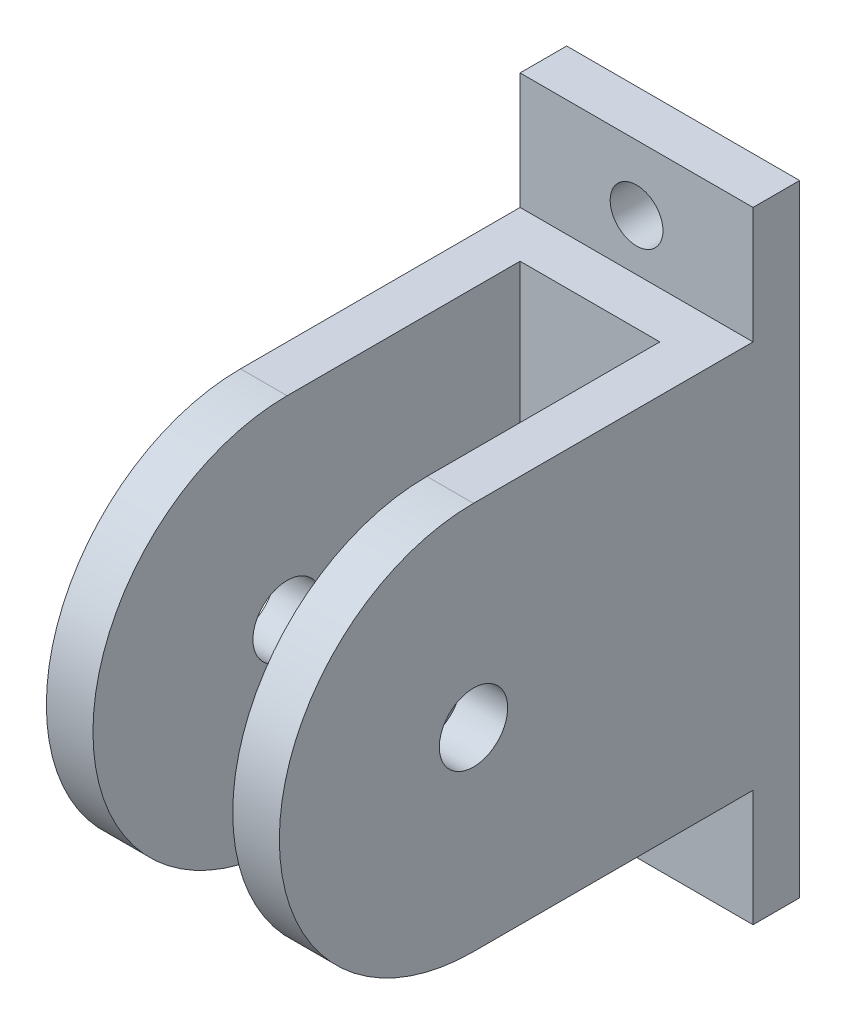
ISO-10303-21;
HEADER;
FILE_DESCRIPTION(('STEP AP214'),'2;1');
FILE_NAME('part.step','',(''),(''),'','','');
FILE_SCHEMA(('AUTOMOTIVE_DESIGN { 1 0 10303 214 1 1 1 1 }'));
ENDSEC;
DATA;
#1=APPLICATION_CONTEXT('core data for automotive mechanical design processes');
#2=APPLICATION_PROTOCOL_DEFINITION('international standard','automotive_design',2000,#1);
#3=PRODUCT_CONTEXT('',#1,'mechanical');
#4=PRODUCT('Part','Part','',(#3));
#5=PRODUCT_RELATED_PRODUCT_CATEGORY('part','',(#4));
#6=PRODUCT_DEFINITION_FORMATION('','',#4);
#7=PRODUCT_DEFINITION_CONTEXT('part definition',#1,'design');
#8=PRODUCT_DEFINITION('design','',#6,#7);
#9=PRODUCT_DEFINITION_SHAPE('','',#8);
#10=(LENGTH_UNIT() NAMED_UNIT(*) SI_UNIT(.MILLI.,.METRE.));
#11=(NAMED_UNIT(*) PLANE_ANGLE_UNIT() SI_UNIT($,.RADIAN.));
#12=(NAMED_UNIT(*) SI_UNIT($,.STERADIAN.) SOLID_ANGLE_UNIT());
#13=UNCERTAINTY_MEASURE_WITH_UNIT(LENGTH_MEASURE(1.E-05),#10,'distance_accuracy_value','');
#14=(GEOMETRIC_REPRESENTATION_CONTEXT(3) GLOBAL_UNCERTAINTY_ASSIGNED_CONTEXT((#13)) GLOBAL_UNIT_ASSIGNED_CONTEXT((#10,
#11,#12)) REPRESENTATION_CONTEXT('',''));
#15=CARTESIAN_POINT('',(0.,0.,0.));
#16=DIRECTION('',(0.,0.,1.));
#17=DIRECTION('',(1.,0.,0.));
#18=AXIS2_PLACEMENT_3D('',#15,#16,#17);
#19=CARTESIAN_POINT('',(0.,0.,6.));
#20=DIRECTION('',(0.,0.,1.));
#21=DIRECTION('',(1.,0.,0.));
#22=AXIS2_PLACEMENT_3D('',#19,#20,#21);
#23=PLANE('',#22);
#24=DIRECTION('',(1.,0.,0.));
#25=VECTOR('',#24,1.);
#26=CARTESIAN_POINT('',(-10.,-12.5,6.));
#27=LINE('',#26,#25);
#28=CARTESIAN_POINT('',(-7.,-12.5,6.));
#29=VERTEX_POINT('',#28);
#30=CARTESIAN_POINT('',(2.,-12.5,6.));
#31=VERTEX_POINT('',#30);
#32=EDGE_CURVE('E50',#29,#31,#27,.T.);
#33=ORIENTED_EDGE('',*,*,#32,.T.);
#34=DIRECTION('',(0.,1.,0.));
#35=VECTOR('',#34,1.);
#36=CARTESIAN_POINT('',(2.,-12.5,6.));
#37=LINE('',#36,#35);
#38=CARTESIAN_POINT('',(2.,12.5,6.));
#39=VERTEX_POINT('',#38);
#40=EDGE_CURVE('E137',#31,#39,#37,.T.);
#41=ORIENTED_EDGE('',*,*,#40,.T.);
#42=DIRECTION('',(-1.,0.,0.));
#43=VECTOR('',#42,1.);
#44=CARTESIAN_POINT('',(-10.,12.5,6.));
#45=LINE('',#44,#43);
#46=CARTESIAN_POINT('',(-7.,12.5,6.));
#47=VERTEX_POINT('',#46);
#48=EDGE_CURVE('E127',#39,#47,#45,.T.);
#49=ORIENTED_EDGE('',*,*,#48,.T.);
#50=DIRECTION('',(0.,-1.,0.));
#51=VECTOR('',#50,1.);
#52=CARTESIAN_POINT('',(-7.,12.5,6.));
#53=LINE('',#52,#51);
#54=EDGE_CURVE('E165',#47,#29,#53,.T.);
#55=ORIENTED_EDGE('',*,*,#54,.T.);
#56=EDGE_LOOP('',(#33,#41,#49,#55));
#57=FACE_BOUND('',#56,.T.);
#58=ADVANCED_FACE('F33',(#57),#23,.T.);
#59=CARTESIAN_POINT('',(0.,0.,3.));
#60=DIRECTION('',(0.,0.,1.));
#61=DIRECTION('',(1.,0.,0.));
#62=AXIS2_PLACEMENT_3D('',#59,#60,#61);
#63=PLANE('',#62);
#64=CARTESIAN_POINT('',(-2.5,15.8,3.));
#65=DIRECTION('',(0.,0.,1.));
#66=DIRECTION('',(1.,0.,0.));
#67=AXIS2_PLACEMENT_3D('',#64,#65,#66);
#68=CIRCLE('',#67,1.7);
#69=CARTESIAN_POINT('',(-0.800000000000002,15.8,3.));
#70=VERTEX_POINT('',#69);
#71=EDGE_CURVE('E286',#70,#70,#68,.T.);
#72=ORIENTED_EDGE('',*,*,#71,.F.);
#73=EDGE_LOOP('',(#72));
#74=FACE_BOUND('',#73,.T.);
#75=DIRECTION('',(-1.,0.,0.));
#76=VECTOR('',#75,1.);
#77=CARTESIAN_POINT('',(-10.,12.5,3.));
#78=LINE('',#77,#76);
#79=CARTESIAN_POINT('',(5.,12.5,3.));
#80=VERTEX_POINT('',#79);
#81=CARTESIAN_POINT('',(-10.,12.5,3.));
#82=VERTEX_POINT('',#81);
#83=EDGE_CURVE('E190',#80,#82,#78,.T.);
#84=ORIENTED_EDGE('',*,*,#83,.F.);
#85=DIRECTION('',(0.,1.,0.));
#86=VECTOR('',#85,1.);
#87=CARTESIAN_POINT('',(5.,20.,3.));
#88=LINE('',#87,#86);
#89=CARTESIAN_POINT('',(5.,20.,3.));
#90=VERTEX_POINT('',#89);
#91=EDGE_CURVE('E192',#80,#90,#88,.T.);
#92=ORIENTED_EDGE('',*,*,#91,.T.);
#93=DIRECTION('',(-1.,0.,0.));
#94=VECTOR('',#93,1.);
#95=CARTESIAN_POINT('',(-10.,20.,3.));
#96=LINE('',#95,#94);
#97=CARTESIAN_POINT('',(-10.,20.,3.));
#98=VERTEX_POINT('',#97);
#99=EDGE_CURVE('E225',#90,#98,#96,.T.);
#100=ORIENTED_EDGE('',*,*,#99,.T.);
#101=DIRECTION('',(0.,-1.,0.));
#102=VECTOR('',#101,1.);
#103=CARTESIAN_POINT('',(-10.,20.,3.));
#104=LINE('',#103,#102);
#105=EDGE_CURVE('E226',#98,#82,#104,.T.);
#106=ORIENTED_EDGE('',*,*,#105,.T.);
#107=EDGE_LOOP('',(#84,#92,#100,#106));
#108=FACE_BOUND('',#107,.T.);
#109=ADVANCED_FACE('F321',(#74,#108),#63,.T.);
#110=CARTESIAN_POINT('',(-10.,20.,3.));
#111=DIRECTION('',(1.,0.,0.));
#112=DIRECTION('',(0.,1.,0.));
#113=AXIS2_PLACEMENT_3D('',#110,#111,#112);
#114=PLANE('',#113);
#115=CARTESIAN_POINT('',(-10.,0.,21.));
#116=DIRECTION('',(1.,0.,0.));
#117=DIRECTION('',(0.,1.,0.));
#118=AXIS2_PLACEMENT_3D('',#115,#116,#117);
#119=CIRCLE('',#118,2.2);
#120=CARTESIAN_POINT('',(-10.,2.2,21.));
#121=VERTEX_POINT('',#120);
#122=EDGE_CURVE('E154',#121,#121,#119,.T.);
#123=ORIENTED_EDGE('',*,*,#122,.T.);
#124=EDGE_LOOP('',(#123));
#125=FACE_BOUND('',#124,.T.);
#126=DIRECTION('',(0.,-1.,0.));
#127=VECTOR('',#126,1.);
#128=CARTESIAN_POINT('',(-10.,20.,0.));
#129=LINE('',#128,#127);
#130=CARTESIAN_POINT('',(-10.,20.,0.));
#131=VERTEX_POINT('',#130);
#132=CARTESIAN_POINT('',(-9.99999999999999,-20.,0.));
#133=VERTEX_POINT('',#132);
#134=EDGE_CURVE('E204',#131,#133,#129,.T.);
#135=ORIENTED_EDGE('',*,*,#134,.T.);
#136=DIRECTION('',(0.,0.,-1.));
#137=VECTOR('',#136,1.);
#138=CARTESIAN_POINT('',(-9.99999999999999,-20.,3.));
#139=LINE('',#138,#137);
#140=CARTESIAN_POINT('',(-9.99999999999999,-20.,3.));
#141=VERTEX_POINT('',#140);
#142=EDGE_CURVE('E11',#141,#133,#139,.T.);
#143=ORIENTED_EDGE('',*,*,#142,.F.);
#144=CARTESIAN_POINT('',(-10.,-12.5,3.));
#145=VERTEX_POINT('',#144);
#146=EDGE_CURVE('E231',#145,#141,#104,.T.);
#147=ORIENTED_EDGE('',*,*,#146,.F.);
#148=DIRECTION('',(0.,0.,-1.));
#149=VECTOR('',#148,1.);
#150=CARTESIAN_POINT('',(-10.,-12.5,6.));
#151=LINE('',#150,#149);
#152=CARTESIAN_POINT('',(-10.,-12.5,21.));
#153=VERTEX_POINT('',#152);
#154=EDGE_CURVE('E198',#153,#145,#151,.T.);
#155=ORIENTED_EDGE('',*,*,#154,.F.);
#156=CARTESIAN_POINT('',(-10.,0.,21.));
#157=DIRECTION('',(-1.,0.,0.));
#158=DIRECTION('',(0.,1.,0.));
#159=AXIS2_PLACEMENT_3D('',#156,#157,#158);
#160=CIRCLE('',#159,12.5);
#161=CARTESIAN_POINT('',(-10.,12.5,21.));
#162=VERTEX_POINT('',#161);
#163=EDGE_CURVE('E158',#153,#162,#160,.T.);
#164=ORIENTED_EDGE('',*,*,#163,.T.);
#165=DIRECTION('',(0.,0.,-1.));
#166=VECTOR('',#165,1.);
#167=CARTESIAN_POINT('',(-10.,12.5,6.));
#168=LINE('',#167,#166);
#169=EDGE_CURVE('E136',#162,#82,#168,.T.);
#170=ORIENTED_EDGE('',*,*,#169,.T.);
#171=ORIENTED_EDGE('',*,*,#105,.F.);
#172=DIRECTION('',(0.,0.,-1.));
#173=VECTOR('',#172,1.);
#174=CARTESIAN_POINT('',(-10.,20.,3.));
#175=LINE('',#174,#173);
#176=EDGE_CURVE('E244',#98,#131,#175,.T.);
#177=ORIENTED_EDGE('',*,*,#176,.T.);
#178=EDGE_LOOP('',(#135,#143,#147,#155,#164,#170,#171,#177));
#179=FACE_BOUND('',#178,.T.);
#180=ADVANCED_FACE('F35',(#125,#179),#114,.F.);
#181=CARTESIAN_POINT('',(-9.99999999999999,-20.,3.));
#182=DIRECTION('',(0.,1.,0.));
#183=DIRECTION('',(0.,0.,1.));
#184=AXIS2_PLACEMENT_3D('',#181,#182,#183);
#185=PLANE('',#184);
#186=DIRECTION('',(1.,0.,0.));
#187=VECTOR('',#186,1.);
#188=CARTESIAN_POINT('',(-9.99999999999999,-20.,0.));
#189=LINE('',#188,#187);
#190=CARTESIAN_POINT('',(5.,-20.,0.));
#191=VERTEX_POINT('',#190);
#192=EDGE_CURVE('E250',#133,#191,#189,.T.);
#193=ORIENTED_EDGE('',*,*,#192,.T.);
#194=DIRECTION('',(0.,0.,-1.));
#195=VECTOR('',#194,1.);
#196=CARTESIAN_POINT('',(5.,-20.,3.));
#197=LINE('',#196,#195);
#198=CARTESIAN_POINT('',(5.,-20.,3.));
#199=VERTEX_POINT('',#198);
#200=EDGE_CURVE('E42',#199,#191,#197,.T.);
#201=ORIENTED_EDGE('',*,*,#200,.F.);
#202=DIRECTION('',(1.,0.,0.));
#203=VECTOR('',#202,1.);
#204=CARTESIAN_POINT('',(-9.99999999999999,-20.,3.));
#205=LINE('',#204,#203);
#206=EDGE_CURVE('E224',#141,#199,#205,.T.);
#207=ORIENTED_EDGE('',*,*,#206,.F.);
#208=ORIENTED_EDGE('',*,*,#142,.T.);
#209=EDGE_LOOP('',(#193,#201,#207,#208));
#210=FACE_BOUND('',#209,.T.);
#211=ADVANCED_FACE('F263',(#210),#185,.F.);
#212=CARTESIAN_POINT('',(5.,20.,3.));
#213=DIRECTION('',(-1.,0.,0.));
#214=DIRECTION('',(0.,-1.,0.));
#215=AXIS2_PLACEMENT_3D('',#212,#213,#214);
#216=PLANE('',#215);
#217=CARTESIAN_POINT('',(5.,0.,21.));
#218=DIRECTION('',(-1.,0.,0.));
#219=DIRECTION('',(0.,-1.,0.));
#220=AXIS2_PLACEMENT_3D('',#217,#218,#219);
#221=CIRCLE('',#220,2.2);
#222=CARTESIAN_POINT('',(5.,-2.2,21.));
#223=VERTEX_POINT('',#222);
#224=EDGE_CURVE('E280',#223,#223,#221,.T.);
#225=ORIENTED_EDGE('',*,*,#224,.T.);
#226=EDGE_LOOP('',(#225));
#227=FACE_BOUND('',#226,.T.);
#228=DIRECTION('',(0.,1.,0.));
#229=VECTOR('',#228,1.);
#230=CARTESIAN_POINT('',(5.,20.,0.));
#231=LINE('',#230,#229);
#232=CARTESIAN_POINT('',(5.,20.,0.));
#233=VERTEX_POINT('',#232);
#234=EDGE_CURVE('E248',#191,#233,#231,.T.);
#235=ORIENTED_EDGE('',*,*,#234,.T.);
#236=DIRECTION('',(0.,0.,-1.));
#237=VECTOR('',#236,1.);
#238=CARTESIAN_POINT('',(5.,20.,3.));
#239=LINE('',#238,#237);
#240=EDGE_CURVE('E220',#90,#233,#239,.T.);
#241=ORIENTED_EDGE('',*,*,#240,.F.);
#242=ORIENTED_EDGE('',*,*,#91,.F.);
#243=DIRECTION('',(0.,0.,-1.));
#244=VECTOR('',#243,1.);
#245=CARTESIAN_POINT('',(5.,12.5,6.));
#246=LINE('',#245,#244);
#247=CARTESIAN_POINT('',(5.,12.5,21.));
#248=VERTEX_POINT('',#247);
#249=EDGE_CURVE('E199',#248,#80,#246,.T.);
#250=ORIENTED_EDGE('',*,*,#249,.F.);
#251=CARTESIAN_POINT('',(5.,0.,21.));
#252=DIRECTION('',(1.,0.,0.));
#253=DIRECTION('',(0.,0.,-1.));
#254=AXIS2_PLACEMENT_3D('',#251,#252,#253);
#255=CIRCLE('',#254,12.5);
#256=CARTESIAN_POINT('',(5.,-12.5,21.));
#257=VERTEX_POINT('',#256);
#258=EDGE_CURVE('E151',#248,#257,#255,.T.);
#259=ORIENTED_EDGE('',*,*,#258,.T.);
#260=DIRECTION('',(0.,0.,-1.));
#261=VECTOR('',#260,1.);
#262=CARTESIAN_POINT('',(5.,-12.5,6.));
#263=LINE('',#262,#261);
#264=CARTESIAN_POINT('',(5.,-12.5,3.));
#265=VERTEX_POINT('',#264);
#266=EDGE_CURVE('E195',#257,#265,#263,.T.);
#267=ORIENTED_EDGE('',*,*,#266,.T.);
#268=EDGE_CURVE('E223',#199,#265,#88,.T.);
#269=ORIENTED_EDGE('',*,*,#268,.F.);
#270=ORIENTED_EDGE('',*,*,#200,.T.);
#271=EDGE_LOOP('',(#235,#241,#242,#250,#259,#267,#269,#270));
#272=FACE_BOUND('',#271,.T.);
#273=ADVANCED_FACE('F217',(#227,#272),#216,.F.);
#274=CARTESIAN_POINT('',(-10.,20.,3.));
#275=DIRECTION('',(0.,-1.,0.));
#276=DIRECTION('',(0.,0.,-1.));
#277=AXIS2_PLACEMENT_3D('',#274,#275,#276);
#278=PLANE('',#277);
#279=DIRECTION('',(-1.,0.,0.));
#280=VECTOR('',#279,1.);
#281=CARTESIAN_POINT('',(-10.,20.,0.));
#282=LINE('',#281,#280);
#283=EDGE_CURVE('E239',#233,#131,#282,.T.);
#284=ORIENTED_EDGE('',*,*,#283,.T.);
#285=ORIENTED_EDGE('',*,*,#176,.F.);
#286=ORIENTED_EDGE('',*,*,#99,.F.);
#287=ORIENTED_EDGE('',*,*,#240,.T.);
#288=EDGE_LOOP('',(#284,#285,#286,#287));
#289=FACE_BOUND('',#288,.T.);
#290=ADVANCED_FACE('F336',(#289),#278,.F.);
#291=CARTESIAN_POINT('',(-2.5,-15.8,3.));
#292=DIRECTION('',(0.,0.,1.));
#293=DIRECTION('',(1.,0.,0.));
#294=AXIS2_PLACEMENT_3D('',#291,#292,#293);
#295=CIRCLE('',#294,1.7);
#296=CARTESIAN_POINT('',(-0.800000000000002,-15.8,3.));
#297=VERTEX_POINT('',#296);
#298=EDGE_CURVE('E292',#297,#297,#295,.T.);
#299=ORIENTED_EDGE('',*,*,#298,.F.);
#300=EDGE_LOOP('',(#299));
#301=FACE_BOUND('',#300,.T.);
#302=DIRECTION('',(1.,0.,0.));
#303=VECTOR('',#302,1.);
#304=CARTESIAN_POINT('',(-10.,-12.5,3.));
#305=LINE('',#304,#303);
#306=EDGE_CURVE('E186',#145,#265,#305,.T.);
#307=ORIENTED_EDGE('',*,*,#306,.F.);
#308=ORIENTED_EDGE('',*,*,#146,.T.);
#309=ORIENTED_EDGE('',*,*,#206,.T.);
#310=ORIENTED_EDGE('',*,*,#268,.T.);
#311=EDGE_LOOP('',(#307,#308,#309,#310));
#312=FACE_BOUND('',#311,.T.);
#313=ADVANCED_FACE('F265',(#301,#312),#63,.T.);
#314=CARTESIAN_POINT('',(0.,0.,0.));
#315=DIRECTION('',(0.,0.,1.));
#316=DIRECTION('',(1.,0.,0.));
#317=AXIS2_PLACEMENT_3D('',#314,#315,#316);
#318=PLANE('',#317);
#319=CARTESIAN_POINT('',(-2.5,-15.8,0.));
#320=DIRECTION('',(0.,0.,-1.));
#321=DIRECTION('',(1.,0.,0.));
#322=AXIS2_PLACEMENT_3D('',#319,#320,#321);
#323=CIRCLE('',#322,1.7);
#324=CARTESIAN_POINT('',(-0.800000000000002,-15.8,0.));
#325=VERTEX_POINT('',#324);
#326=EDGE_CURVE('E295',#325,#325,#323,.T.);
#327=ORIENTED_EDGE('',*,*,#326,.F.);
#328=EDGE_LOOP('',(#327));
#329=FACE_BOUND('',#328,.T.);
#330=CARTESIAN_POINT('',(-2.5,15.8,0.));
#331=DIRECTION('',(0.,0.,-1.));
#332=DIRECTION('',(-1.,0.,0.));
#333=AXIS2_PLACEMENT_3D('',#330,#331,#332);
#334=CIRCLE('',#333,1.7);
#335=CARTESIAN_POINT('',(-4.2,15.8,0.));
#336=VERTEX_POINT('',#335);
#337=EDGE_CURVE('E289',#336,#336,#334,.T.);
#338=ORIENTED_EDGE('',*,*,#337,.F.);
#339=EDGE_LOOP('',(#338));
#340=FACE_BOUND('',#339,.T.);
#341=ORIENTED_EDGE('',*,*,#134,.F.);
#342=ORIENTED_EDGE('',*,*,#283,.F.);
#343=ORIENTED_EDGE('',*,*,#234,.F.);
#344=ORIENTED_EDGE('',*,*,#192,.F.);
#345=EDGE_LOOP('',(#341,#342,#343,#344));
#346=FACE_BOUND('',#345,.T.);
#347=ADVANCED_FACE('F260',(#329,#340,#346),#318,.F.);
#348=CARTESIAN_POINT('',(-10.,-12.5,6.));
#349=DIRECTION('',(0.,1.,0.));
#350=DIRECTION('',(0.,0.,1.));
#351=AXIS2_PLACEMENT_3D('',#348,#349,#350);
#352=PLANE('',#351);
#353=ORIENTED_EDGE('',*,*,#306,.T.);
#354=ORIENTED_EDGE('',*,*,#266,.F.);
#355=DIRECTION('',(1.,0.,0.));
#356=VECTOR('',#355,1.);
#357=CARTESIAN_POINT('',(2.,-12.5,21.));
#358=LINE('',#357,#356);
#359=CARTESIAN_POINT('',(2.,-12.5,21.));
#360=VERTEX_POINT('',#359);
#361=EDGE_CURVE('E155',#360,#257,#358,.T.);
#362=ORIENTED_EDGE('',*,*,#361,.F.);
#363=DIRECTION('',(0.,0.,-1.));
#364=VECTOR('',#363,1.);
#365=CARTESIAN_POINT('',(2.,-12.5,6.));
#366=LINE('',#365,#364);
#367=EDGE_CURVE('E141',#360,#31,#366,.T.);
#368=ORIENTED_EDGE('',*,*,#367,.T.);
#369=ORIENTED_EDGE('',*,*,#32,.F.);
#370=DIRECTION('',(0.,0.,1.));
#371=VECTOR('',#370,1.);
#372=CARTESIAN_POINT('',(-7.,-12.5,6.));
#373=LINE('',#372,#371);
#374=CARTESIAN_POINT('',(-7.,-12.5,21.));
#375=VERTEX_POINT('',#374);
#376=EDGE_CURVE('E58',#29,#375,#373,.T.);
#377=ORIENTED_EDGE('',*,*,#376,.T.);
#378=DIRECTION('',(-1.,0.,0.));
#379=VECTOR('',#378,1.);
#380=CARTESIAN_POINT('',(-7.,-12.5,21.));
#381=LINE('',#380,#379);
#382=EDGE_CURVE('E174',#375,#153,#381,.T.);
#383=ORIENTED_EDGE('',*,*,#382,.T.);
#384=ORIENTED_EDGE('',*,*,#154,.T.);
#385=EDGE_LOOP('',(#353,#354,#362,#368,#369,#377,#383,#384));
#386=FACE_BOUND('',#385,.T.);
#387=ADVANCED_FACE('F267',(#386),#352,.F.);
#388=CARTESIAN_POINT('',(-10.,12.5,6.));
#389=DIRECTION('',(0.,-1.,0.));
#390=DIRECTION('',(0.,0.,-1.));
#391=AXIS2_PLACEMENT_3D('',#388,#389,#390);
#392=PLANE('',#391);
#393=ORIENTED_EDGE('',*,*,#83,.T.);
#394=ORIENTED_EDGE('',*,*,#169,.F.);
#395=DIRECTION('',(-1.,0.,0.));
#396=VECTOR('',#395,1.);
#397=CARTESIAN_POINT('',(-7.,12.5,21.));
#398=LINE('',#397,#396);
#399=CARTESIAN_POINT('',(-7.,12.5,21.));
#400=VERTEX_POINT('',#399);
#401=EDGE_CURVE('E191',#400,#162,#398,.T.);
#402=ORIENTED_EDGE('',*,*,#401,.F.);
#403=DIRECTION('',(0.,0.,-1.));
#404=VECTOR('',#403,1.);
#405=CARTESIAN_POINT('',(-7.,12.5,6.));
#406=LINE('',#405,#404);
#407=EDGE_CURVE('E135',#400,#47,#406,.T.);
#408=ORIENTED_EDGE('',*,*,#407,.T.);
#409=ORIENTED_EDGE('',*,*,#48,.F.);
#410=DIRECTION('',(0.,0.,1.));
#411=VECTOR('',#410,1.);
#412=CARTESIAN_POINT('',(2.,12.5,6.));
#413=LINE('',#412,#411);
#414=CARTESIAN_POINT('',(2.,12.5,21.));
#415=VERTEX_POINT('',#414);
#416=EDGE_CURVE('E132',#39,#415,#413,.T.);
#417=ORIENTED_EDGE('',*,*,#416,.T.);
#418=DIRECTION('',(1.,0.,0.));
#419=VECTOR('',#418,1.);
#420=CARTESIAN_POINT('',(2.,12.5,21.));
#421=LINE('',#420,#419);
#422=EDGE_CURVE('E147',#415,#248,#421,.T.);
#423=ORIENTED_EDGE('',*,*,#422,.T.);
#424=ORIENTED_EDGE('',*,*,#249,.T.);
#425=EDGE_LOOP('',(#393,#394,#402,#408,#409,#417,#423,#424));
#426=FACE_BOUND('',#425,.T.);
#427=ADVANCED_FACE('F129',(#426),#392,.F.);
#428=CARTESIAN_POINT('',(-7.,0.,21.));
#429=DIRECTION('',(-1.,0.,0.));
#430=DIRECTION('',(0.,-1.,0.));
#431=AXIS2_PLACEMENT_3D('',#428,#429,#430);
#432=CYLINDRICAL_SURFACE('',#431,12.5);
#433=ORIENTED_EDGE('',*,*,#163,.F.);
#434=ORIENTED_EDGE('',*,*,#382,.F.);
#435=CARTESIAN_POINT('',(-7.,0.,21.));
#436=DIRECTION('',(-1.,0.,0.));
#437=DIRECTION('',(0.,1.,0.));
#438=AXIS2_PLACEMENT_3D('',#435,#436,#437);
#439=CIRCLE('',#438,12.5);
#440=EDGE_CURVE('E162',#375,#400,#439,.T.);
#441=ORIENTED_EDGE('',*,*,#440,.T.);
#442=ORIENTED_EDGE('',*,*,#401,.T.);
#443=EDGE_LOOP('',(#433,#434,#441,#442));
#444=FACE_BOUND('',#443,.T.);
#445=ADVANCED_FACE('F275',(#444),#432,.T.);
#446=CARTESIAN_POINT('',(-7.,0.,21.));
#447=DIRECTION('',(1.,0.,0.));
#448=DIRECTION('',(0.,1.,0.));
#449=AXIS2_PLACEMENT_3D('',#446,#447,#448);
#450=PLANE('',#449);
#451=CARTESIAN_POINT('',(-7.,0.,21.));
#452=DIRECTION('',(1.,0.,0.));
#453=DIRECTION('',(0.,1.,0.));
#454=AXIS2_PLACEMENT_3D('',#451,#452,#453);
#455=CIRCLE('',#454,2.2);
#456=CARTESIAN_POINT('',(-7.,2.2,21.));
#457=VERTEX_POINT('',#456);
#458=EDGE_CURVE('E283',#457,#457,#455,.T.);
#459=ORIENTED_EDGE('',*,*,#458,.F.);
#460=EDGE_LOOP('',(#459));
#461=FACE_BOUND('',#460,.T.);
#462=ORIENTED_EDGE('',*,*,#54,.F.);
#463=ORIENTED_EDGE('',*,*,#407,.F.);
#464=ORIENTED_EDGE('',*,*,#440,.F.);
#465=ORIENTED_EDGE('',*,*,#376,.F.);
#466=EDGE_LOOP('',(#462,#463,#464,#465));
#467=FACE_BOUND('',#466,.T.);
#468=ADVANCED_FACE('F276',(#461,#467),#450,.T.);
#469=CARTESIAN_POINT('',(2.,0.,21.));
#470=DIRECTION('',(1.,0.,0.));
#471=DIRECTION('',(0.,0.,-1.));
#472=AXIS2_PLACEMENT_3D('',#469,#470,#471);
#473=CYLINDRICAL_SURFACE('',#472,12.5);
#474=ORIENTED_EDGE('',*,*,#258,.F.);
#475=ORIENTED_EDGE('',*,*,#422,.F.);
#476=CARTESIAN_POINT('',(2.,0.,21.));
#477=DIRECTION('',(1.,0.,0.));
#478=DIRECTION('',(0.,0.,-1.));
#479=AXIS2_PLACEMENT_3D('',#476,#477,#478);
#480=CIRCLE('',#479,12.5);
#481=EDGE_CURVE('E145',#415,#360,#480,.T.);
#482=ORIENTED_EDGE('',*,*,#481,.T.);
#483=ORIENTED_EDGE('',*,*,#361,.T.);
#484=EDGE_LOOP('',(#474,#475,#482,#483));
#485=FACE_BOUND('',#484,.T.);
#486=ADVANCED_FACE('F399',(#485),#473,.T.);
#487=CARTESIAN_POINT('',(2.,0.,21.));
#488=DIRECTION('',(1.,0.,0.));
#489=DIRECTION('',(0.,0.,-1.));
#490=AXIS2_PLACEMENT_3D('',#487,#488,#489);
#491=PLANE('',#490);
#492=CARTESIAN_POINT('',(2.,0.,21.));
#493=DIRECTION('',(1.,0.,0.));
#494=DIRECTION('',(0.,0.,-1.));
#495=AXIS2_PLACEMENT_3D('',#492,#493,#494);
#496=CIRCLE('',#495,2.2);
#497=CARTESIAN_POINT('',(2.,0.,18.8));
#498=VERTEX_POINT('',#497);
#499=EDGE_CURVE('E37',#498,#498,#496,.T.);
#500=ORIENTED_EDGE('',*,*,#499,.T.);
#501=EDGE_LOOP('',(#500));
#502=FACE_BOUND('',#501,.T.);
#503=ORIENTED_EDGE('',*,*,#367,.F.);
#504=ORIENTED_EDGE('',*,*,#481,.F.);
#505=ORIENTED_EDGE('',*,*,#416,.F.);
#506=ORIENTED_EDGE('',*,*,#40,.F.);
#507=EDGE_LOOP('',(#503,#504,#505,#506));
#508=FACE_BOUND('',#507,.T.);
#509=ADVANCED_FACE('F143',(#502,#508),#491,.F.);
#510=CARTESIAN_POINT('',(5.00005,0.,21.));
#511=DIRECTION('',(-1.,0.,0.));
#512=DIRECTION('',(0.,-1.,0.));
#513=AXIS2_PLACEMENT_3D('',#510,#511,#512);
#514=CYLINDRICAL_SURFACE('',#513,2.2);
#515=ORIENTED_EDGE('',*,*,#499,.F.);
#516=EDGE_LOOP('',(#515));
#517=FACE_BOUND('',#516,.T.);
#518=ORIENTED_EDGE('',*,*,#224,.F.);
#519=EDGE_LOOP('',(#518));
#520=FACE_BOUND('',#519,.T.);
#521=ADVANCED_FACE('F317',(#517,#520),#514,.F.);
#522=ORIENTED_EDGE('',*,*,#458,.T.);
#523=EDGE_LOOP('',(#522));
#524=FACE_BOUND('',#523,.T.);
#525=ORIENTED_EDGE('',*,*,#122,.F.);
#526=EDGE_LOOP('',(#525));
#527=FACE_BOUND('',#526,.T.);
#528=ADVANCED_FACE('F308',(#524,#527),#514,.F.);
#529=CARTESIAN_POINT('',(-2.5,15.8,7.));
#530=DIRECTION('',(0.,0.,-1.));
#531=DIRECTION('',(-1.,0.,0.));
#532=AXIS2_PLACEMENT_3D('',#529,#530,#531);
#533=CYLINDRICAL_SURFACE('',#532,1.7);
#534=ORIENTED_EDGE('',*,*,#71,.T.);
#535=EDGE_LOOP('',(#534));
#536=FACE_BOUND('',#535,.T.);
#537=ORIENTED_EDGE('',*,*,#337,.T.);
#538=EDGE_LOOP('',(#537));
#539=FACE_BOUND('',#538,.T.);
#540=ADVANCED_FACE('F306',(#536,#539),#533,.F.);
#541=CARTESIAN_POINT('',(-2.5,-15.8,7.));
#542=DIRECTION('',(0.,0.,-1.));
#543=DIRECTION('',(-1.,0.,0.));
#544=AXIS2_PLACEMENT_3D('',#541,#542,#543);
#545=CYLINDRICAL_SURFACE('',#544,1.7);
#546=ORIENTED_EDGE('',*,*,#298,.T.);
#547=EDGE_LOOP('',(#546));
#548=FACE_BOUND('',#547,.T.);
#549=ORIENTED_EDGE('',*,*,#326,.T.);
#550=EDGE_LOOP('',(#549));
#551=FACE_BOUND('',#550,.T.);
#552=ADVANCED_FACE('F299',(#548,#551),#545,.F.);
#553=CLOSED_SHELL('',(#58,#109,#180,#211,#273,#290,#313,#347,#387,#427,#445,#468,#486,#509,#521,
#528,#540,#552));
#554=MANIFOLD_SOLID_BREP('B2',#553);
#555=ADVANCED_BREP_SHAPE_REPRESENTATION('',(#18,#554),#14);
#556=SHAPE_DEFINITION_REPRESENTATION(#9,#555);
ENDSEC;
END-ISO-10303-21;
